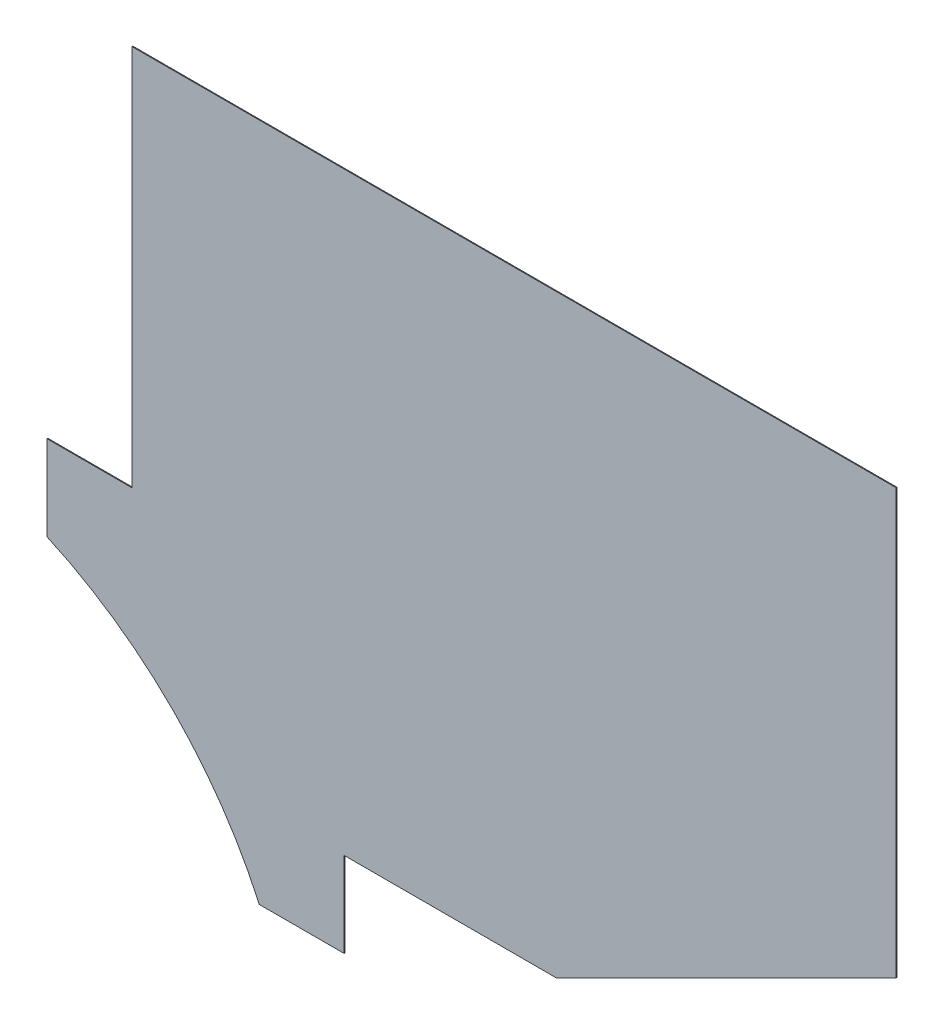
ISO-10303-21;
HEADER;
FILE_DESCRIPTION(('STEP AP214'),'2;1');
FILE_NAME('part.step','',(''),(''),'','','');
FILE_SCHEMA(('AUTOMOTIVE_DESIGN { 1 0 10303 214 1 1 1 1 }'));
ENDSEC;
DATA;
#1=APPLICATION_CONTEXT('core data for automotive mechanical design processes');
#2=APPLICATION_PROTOCOL_DEFINITION('international standard','automotive_design',2000,#1);
#3=PRODUCT_CONTEXT('',#1,'mechanical');
#4=PRODUCT('Part','Part','',(#3));
#5=PRODUCT_RELATED_PRODUCT_CATEGORY('part','',(#4));
#6=PRODUCT_DEFINITION_FORMATION('','',#4);
#7=PRODUCT_DEFINITION_CONTEXT('part definition',#1,'design');
#8=PRODUCT_DEFINITION('design','',#6,#7);
#9=PRODUCT_DEFINITION_SHAPE('','',#8);
#10=(LENGTH_UNIT() NAMED_UNIT(*) SI_UNIT(.MILLI.,.METRE.));
#11=(NAMED_UNIT(*) PLANE_ANGLE_UNIT() SI_UNIT($,.RADIAN.));
#12=(NAMED_UNIT(*) SI_UNIT($,.STERADIAN.) SOLID_ANGLE_UNIT());
#13=UNCERTAINTY_MEASURE_WITH_UNIT(LENGTH_MEASURE(1.E-05),#10,'distance_accuracy_value','');
#14=(GEOMETRIC_REPRESENTATION_CONTEXT(3) GLOBAL_UNCERTAINTY_ASSIGNED_CONTEXT((#13)) GLOBAL_UNIT_ASSIGNED_CONTEXT((#10,
#11,#12)) REPRESENTATION_CONTEXT('',''));
#15=CARTESIAN_POINT('',(0.,0.,0.));
#16=DIRECTION('',(0.,0.,1.));
#17=DIRECTION('',(1.,0.,0.));
#18=AXIS2_PLACEMENT_3D('',#15,#16,#17);
#19=CARTESIAN_POINT('',(-0.8,-1.05,0.));
#20=DIRECTION('',(0.447213595499957,-0.894427190999916,0.));
#21=DIRECTION('',(0.,0.,-1.));
#22=AXIS2_PLACEMENT_3D('',#19,#20,#21);
#23=PLANE('',#22);
#24=DIRECTION('',(-0.894427190999916,-0.447213595499957,0.));
#25=VECTOR('',#24,1.);
#26=CARTESIAN_POINT('',(-0.88,-1.09,0.001));
#27=LINE('',#26,#25);
#28=CARTESIAN_POINT('',(-0.6,-0.95,0.001));
#29=VERTEX_POINT('',#28);
#30=CARTESIAN_POINT('',(-1.,-1.15,0.001));
#31=VERTEX_POINT('',#30);
#32=EDGE_CURVE('E11',#29,#31,#27,.T.);
#33=ORIENTED_EDGE('',*,*,#32,.T.);
#34=DIRECTION('',(0.,0.,-1.));
#35=VECTOR('',#34,1.);
#36=CARTESIAN_POINT('',(-1.,-1.15,0.));
#37=LINE('',#36,#35);
#38=CARTESIAN_POINT('',(-1.,-1.15,0.));
#39=VERTEX_POINT('',#38);
#40=EDGE_CURVE('E24',#31,#39,#37,.T.);
#41=ORIENTED_EDGE('',*,*,#40,.T.);
#42=DIRECTION('',(0.894427190999916,0.447213595499957,0.));
#43=VECTOR('',#42,1.);
#44=CARTESIAN_POINT('',(-0.88,-1.09,0.));
#45=LINE('',#44,#43);
#46=CARTESIAN_POINT('',(-0.6,-0.95,0.));
#47=VERTEX_POINT('',#46);
#48=EDGE_CURVE('E178',#39,#47,#45,.T.);
#49=ORIENTED_EDGE('',*,*,#48,.T.);
#50=DIRECTION('',(0.,0.,1.));
#51=VECTOR('',#50,1.);
#52=CARTESIAN_POINT('',(-0.6,-0.95,0.));
#53=LINE('',#52,#51);
#54=EDGE_CURVE('E176',#47,#29,#53,.T.);
#55=ORIENTED_EDGE('',*,*,#54,.T.);
#56=EDGE_LOOP('',(#33,#41,#49,#55));
#57=FACE_BOUND('',#56,.T.);
#58=ADVANCED_FACE('F17',(#57),#23,.T.);
#59=CARTESIAN_POINT('',(-1.1,-0.85,0.001));
#60=DIRECTION('',(0.,0.,-1.));
#61=DIRECTION('',(1.,0.,0.));
#62=AXIS2_PLACEMENT_3D('',#59,#60,#61);
#63=PLANE('',#62);
#64=ORIENTED_EDGE('',*,*,#32,.F.);
#65=DIRECTION('',(0.,-1.,0.));
#66=VECTOR('',#65,1.);
#67=CARTESIAN_POINT('',(-0.6,-0.45,0.001));
#68=LINE('',#67,#66);
#69=CARTESIAN_POINT('',(-0.6,-0.45,0.001));
#70=VERTEX_POINT('',#69);
#71=EDGE_CURVE('E173',#70,#29,#68,.T.);
#72=ORIENTED_EDGE('',*,*,#71,.F.);
#73=DIRECTION('',(1.,0.,0.));
#74=VECTOR('',#73,1.);
#75=CARTESIAN_POINT('',(-1.5,-0.45,0.001));
#76=LINE('',#75,#74);
#77=CARTESIAN_POINT('',(-1.5,-0.45,0.001));
#78=VERTEX_POINT('',#77);
#79=EDGE_CURVE('E170',#78,#70,#76,.T.);
#80=ORIENTED_EDGE('',*,*,#79,.F.);
#81=DIRECTION('',(0.,1.,0.));
#82=VECTOR('',#81,1.);
#83=CARTESIAN_POINT('',(-1.5,-0.9,0.001));
#84=LINE('',#83,#82);
#85=CARTESIAN_POINT('',(-1.5,-0.9,0.001));
#86=VERTEX_POINT('',#85);
#87=EDGE_CURVE('E167',#86,#78,#84,.T.);
#88=ORIENTED_EDGE('',*,*,#87,.F.);
#89=DIRECTION('',(1.,0.,0.));
#90=VECTOR('',#89,1.);
#91=CARTESIAN_POINT('',(-1.6,-0.9,0.001));
#92=LINE('',#91,#90);
#93=CARTESIAN_POINT('',(-1.6,-0.9,0.001));
#94=VERTEX_POINT('',#93);
#95=EDGE_CURVE('E165',#94,#86,#92,.T.);
#96=ORIENTED_EDGE('',*,*,#95,.F.);
#97=DIRECTION('',(0.,1.,0.));
#98=VECTOR('',#97,1.);
#99=CARTESIAN_POINT('',(-1.6,-1.,0.001));
#100=LINE('',#99,#98);
#101=CARTESIAN_POINT('',(-1.6,-1.,0.001));
#102=VERTEX_POINT('',#101);
#103=EDGE_CURVE('E107',#102,#94,#100,.T.);
#104=ORIENTED_EDGE('',*,*,#103,.F.);
#105=CARTESIAN_POINT('',(-1.805718913883,-1.455718913883,0.001));
#106=DIRECTION('',(0.,0.,1.));
#107=DIRECTION('',(-0.411437827766147,-0.911437827766148,0.));
#108=AXIS2_PLACEMENT_3D('',#105,#106,#107);
#109=CIRCLE('',#108,0.5);
#110=CARTESIAN_POINT('',(-1.35,-1.25,0.001));
#111=VERTEX_POINT('',#110);
#112=EDGE_CURVE('E161',#111,#102,#109,.T.);
#113=ORIENTED_EDGE('',*,*,#112,.F.);
#114=DIRECTION('',(-1.,0.,0.));
#115=VECTOR('',#114,1.);
#116=CARTESIAN_POINT('',(1.35,-1.25,0.001));
#117=LINE('',#116,#115);
#118=CARTESIAN_POINT('',(-1.25,-1.25,0.001));
#119=VERTEX_POINT('',#118);
#120=EDGE_CURVE('E158',#119,#111,#117,.T.);
#121=ORIENTED_EDGE('',*,*,#120,.F.);
#122=DIRECTION('',(0.,-1.,0.));
#123=VECTOR('',#122,1.);
#124=CARTESIAN_POINT('',(-1.25,-1.15,0.001));
#125=LINE('',#124,#123);
#126=CARTESIAN_POINT('',(-1.25,-1.15,0.001));
#127=VERTEX_POINT('',#126);
#128=EDGE_CURVE('E155',#127,#119,#125,.T.);
#129=ORIENTED_EDGE('',*,*,#128,.F.);
#130=DIRECTION('',(-1.,0.,0.));
#131=VECTOR('',#130,1.);
#132=CARTESIAN_POINT('',(-0.6,-1.15,0.001));
#133=LINE('',#132,#131);
#134=EDGE_CURVE('E152',#31,#127,#133,.T.);
#135=ORIENTED_EDGE('',*,*,#134,.F.);
#136=EDGE_LOOP('',(#64,#72,#80,#88,#96,#104,#113,#121,#129,#135));
#137=FACE_BOUND('',#136,.T.);
#138=ADVANCED_FACE('F191',(#137),#63,.F.);
#139=CARTESIAN_POINT('',(-0.6,-0.45,0.));
#140=DIRECTION('',(-1.,0.,0.));
#141=DIRECTION('',(0.,-1.,0.));
#142=AXIS2_PLACEMENT_3D('',#139,#140,#141);
#143=PLANE('',#142);
#144=ORIENTED_EDGE('',*,*,#54,.F.);
#145=DIRECTION('',(0.,-1.,0.));
#146=VECTOR('',#145,1.);
#147=CARTESIAN_POINT('',(-0.6,-0.45,0.));
#148=LINE('',#147,#146);
#149=CARTESIAN_POINT('',(-0.6,-0.45,0.));
#150=VERTEX_POINT('',#149);
#151=EDGE_CURVE('E149',#150,#47,#148,.T.);
#152=ORIENTED_EDGE('',*,*,#151,.F.);
#153=DIRECTION('',(0.,0.,1.));
#154=VECTOR('',#153,1.);
#155=CARTESIAN_POINT('',(-0.6,-0.45,0.));
#156=LINE('',#155,#154);
#157=EDGE_CURVE('E146',#150,#70,#156,.T.);
#158=ORIENTED_EDGE('',*,*,#157,.T.);
#159=ORIENTED_EDGE('',*,*,#71,.T.);
#160=EDGE_LOOP('',(#144,#152,#158,#159));
#161=FACE_BOUND('',#160,.T.);
#162=ADVANCED_FACE('F199',(#161),#143,.F.);
#163=CARTESIAN_POINT('',(-1.805718913883,-1.455718913883,0.));
#164=DIRECTION('',(0.,0.,-1.));
#165=DIRECTION('',(-0.411437827766147,-0.911437827766148,0.));
#166=AXIS2_PLACEMENT_3D('',#163,#164,#165);
#167=CYLINDRICAL_SURFACE('',#166,0.5);
#168=CARTESIAN_POINT('',(-1.805718913883,-1.455718913883,0.));
#169=DIRECTION('',(0.,0.,1.));
#170=DIRECTION('',(-0.411437827766147,-0.911437827766148,0.));
#171=AXIS2_PLACEMENT_3D('',#168,#169,#170);
#172=CIRCLE('',#171,0.5);
#173=CARTESIAN_POINT('',(-1.35,-1.25,0.));
#174=VERTEX_POINT('',#173);
#175=CARTESIAN_POINT('',(-1.6,-1.,0.));
#176=VERTEX_POINT('',#175);
#177=EDGE_CURVE('E114',#174,#176,#172,.T.);
#178=ORIENTED_EDGE('',*,*,#177,.F.);
#179=DIRECTION('',(0.,0.,1.));
#180=VECTOR('',#179,1.);
#181=CARTESIAN_POINT('',(-1.35,-1.25,0.));
#182=LINE('',#181,#180);
#183=EDGE_CURVE('E142',#174,#111,#182,.T.);
#184=ORIENTED_EDGE('',*,*,#183,.T.);
#185=ORIENTED_EDGE('',*,*,#112,.T.);
#186=DIRECTION('',(0.,0.,1.));
#187=VECTOR('',#186,1.);
#188=CARTESIAN_POINT('',(-1.6,-1.,0.));
#189=LINE('',#188,#187);
#190=EDGE_CURVE('E140',#176,#102,#189,.T.);
#191=ORIENTED_EDGE('',*,*,#190,.F.);
#192=EDGE_LOOP('',(#178,#184,#185,#191));
#193=FACE_BOUND('',#192,.T.);
#194=ADVANCED_FACE('F190',(#193),#167,.F.);
#195=CARTESIAN_POINT('',(-1.25,-1.25,0.));
#196=DIRECTION('',(0.,1.,0.));
#197=DIRECTION('',(-1.,0.,0.));
#198=AXIS2_PLACEMENT_3D('',#195,#196,#197);
#199=PLANE('',#198);
#200=DIRECTION('',(-1.,0.,0.));
#201=VECTOR('',#200,1.);
#202=CARTESIAN_POINT('',(1.35,-1.25,0.));
#203=LINE('',#202,#201);
#204=CARTESIAN_POINT('',(-1.25,-1.25,0.));
#205=VERTEX_POINT('',#204);
#206=EDGE_CURVE('E138',#205,#174,#203,.T.);
#207=ORIENTED_EDGE('',*,*,#206,.F.);
#208=DIRECTION('',(0.,0.,1.));
#209=VECTOR('',#208,1.);
#210=CARTESIAN_POINT('',(-1.25,-1.25,0.));
#211=LINE('',#210,#209);
#212=EDGE_CURVE('E135',#205,#119,#211,.T.);
#213=ORIENTED_EDGE('',*,*,#212,.T.);
#214=ORIENTED_EDGE('',*,*,#120,.T.);
#215=ORIENTED_EDGE('',*,*,#183,.F.);
#216=EDGE_LOOP('',(#207,#213,#214,#215));
#217=FACE_BOUND('',#216,.T.);
#218=ADVANCED_FACE('F188',(#217),#199,.F.);
#219=CARTESIAN_POINT('',(-1.25,-1.15,0.));
#220=DIRECTION('',(-1.,0.,0.));
#221=DIRECTION('',(0.,-1.,0.));
#222=AXIS2_PLACEMENT_3D('',#219,#220,#221);
#223=PLANE('',#222);
#224=DIRECTION('',(0.,-1.,0.));
#225=VECTOR('',#224,1.);
#226=CARTESIAN_POINT('',(-1.25,-1.15,0.));
#227=LINE('',#226,#225);
#228=CARTESIAN_POINT('',(-1.25,-1.15,0.));
#229=VERTEX_POINT('',#228);
#230=EDGE_CURVE('E132',#229,#205,#227,.T.);
#231=ORIENTED_EDGE('',*,*,#230,.F.);
#232=DIRECTION('',(0.,0.,1.));
#233=VECTOR('',#232,1.);
#234=CARTESIAN_POINT('',(-1.25,-1.15,0.));
#235=LINE('',#234,#233);
#236=EDGE_CURVE('E129',#229,#127,#235,.T.);
#237=ORIENTED_EDGE('',*,*,#236,.T.);
#238=ORIENTED_EDGE('',*,*,#128,.T.);
#239=ORIENTED_EDGE('',*,*,#212,.F.);
#240=EDGE_LOOP('',(#231,#237,#238,#239));
#241=FACE_BOUND('',#240,.T.);
#242=ADVANCED_FACE('F185',(#241),#223,.F.);
#243=CARTESIAN_POINT('',(-0.6,-1.15,0.));
#244=DIRECTION('',(0.,1.,0.));
#245=DIRECTION('',(-1.,0.,0.));
#246=AXIS2_PLACEMENT_3D('',#243,#244,#245);
#247=PLANE('',#246);
#248=ORIENTED_EDGE('',*,*,#40,.F.);
#249=ORIENTED_EDGE('',*,*,#134,.T.);
#250=ORIENTED_EDGE('',*,*,#236,.F.);
#251=DIRECTION('',(-1.,0.,0.));
#252=VECTOR('',#251,1.);
#253=CARTESIAN_POINT('',(-0.6,-1.15,0.));
#254=LINE('',#253,#252);
#255=EDGE_CURVE('E126',#39,#229,#254,.T.);
#256=ORIENTED_EDGE('',*,*,#255,.F.);
#257=EDGE_LOOP('',(#248,#249,#250,#256));
#258=FACE_BOUND('',#257,.T.);
#259=ADVANCED_FACE('F183',(#258),#247,.F.);
#260=CARTESIAN_POINT('',(-1.5,-0.45,0.));
#261=DIRECTION('',(0.,-1.,0.));
#262=DIRECTION('',(1.,0.,0.));
#263=AXIS2_PLACEMENT_3D('',#260,#261,#262);
#264=PLANE('',#263);
#265=DIRECTION('',(1.,0.,0.));
#266=VECTOR('',#265,1.);
#267=CARTESIAN_POINT('',(-1.5,-0.45,0.));
#268=LINE('',#267,#266);
#269=CARTESIAN_POINT('',(-1.5,-0.45,0.));
#270=VERTEX_POINT('',#269);
#271=EDGE_CURVE('E123',#270,#150,#268,.T.);
#272=ORIENTED_EDGE('',*,*,#271,.F.);
#273=DIRECTION('',(0.,0.,1.));
#274=VECTOR('',#273,1.);
#275=CARTESIAN_POINT('',(-1.5,-0.45,0.));
#276=LINE('',#275,#274);
#277=EDGE_CURVE('E120',#270,#78,#276,.T.);
#278=ORIENTED_EDGE('',*,*,#277,.T.);
#279=ORIENTED_EDGE('',*,*,#79,.T.);
#280=ORIENTED_EDGE('',*,*,#157,.F.);
#281=EDGE_LOOP('',(#272,#278,#279,#280));
#282=FACE_BOUND('',#281,.T.);
#283=ADVANCED_FACE('F197',(#282),#264,.F.);
#284=CARTESIAN_POINT('',(-1.5,-0.9,0.));
#285=DIRECTION('',(1.,0.,0.));
#286=DIRECTION('',(0.,1.,0.));
#287=AXIS2_PLACEMENT_3D('',#284,#285,#286);
#288=PLANE('',#287);
#289=DIRECTION('',(0.,1.,0.));
#290=VECTOR('',#289,1.);
#291=CARTESIAN_POINT('',(-1.5,-0.9,0.));
#292=LINE('',#291,#290);
#293=CARTESIAN_POINT('',(-1.5,-0.9,0.));
#294=VERTEX_POINT('',#293);
#295=EDGE_CURVE('E118',#294,#270,#292,.T.);
#296=ORIENTED_EDGE('',*,*,#295,.F.);
#297=DIRECTION('',(0.,0.,1.));
#298=VECTOR('',#297,1.);
#299=CARTESIAN_POINT('',(-1.5,-0.9,0.));
#300=LINE('',#299,#298);
#301=EDGE_CURVE('E96',#294,#86,#300,.T.);
#302=ORIENTED_EDGE('',*,*,#301,.T.);
#303=ORIENTED_EDGE('',*,*,#87,.T.);
#304=ORIENTED_EDGE('',*,*,#277,.F.);
#305=EDGE_LOOP('',(#296,#302,#303,#304));
#306=FACE_BOUND('',#305,.T.);
#307=ADVANCED_FACE('F193',(#306),#288,.F.);
#308=CARTESIAN_POINT('',(-1.6,-0.9,0.));
#309=DIRECTION('',(0.,-1.,0.));
#310=DIRECTION('',(1.,0.,0.));
#311=AXIS2_PLACEMENT_3D('',#308,#309,#310);
#312=PLANE('',#311);
#313=DIRECTION('',(1.,0.,0.));
#314=VECTOR('',#313,1.);
#315=CARTESIAN_POINT('',(-1.6,-0.9,0.));
#316=LINE('',#315,#314);
#317=CARTESIAN_POINT('',(-1.6,-0.9,0.));
#318=VERTEX_POINT('',#317);
#319=EDGE_CURVE('E90',#318,#294,#316,.T.);
#320=ORIENTED_EDGE('',*,*,#319,.F.);
#321=DIRECTION('',(0.,0.,1.));
#322=VECTOR('',#321,1.);
#323=CARTESIAN_POINT('',(-1.6,-0.9,0.));
#324=LINE('',#323,#322);
#325=EDGE_CURVE('E94',#318,#94,#324,.T.);
#326=ORIENTED_EDGE('',*,*,#325,.T.);
#327=ORIENTED_EDGE('',*,*,#95,.T.);
#328=ORIENTED_EDGE('',*,*,#301,.F.);
#329=EDGE_LOOP('',(#320,#326,#327,#328));
#330=FACE_BOUND('',#329,.T.);
#331=ADVANCED_FACE('F92',(#330),#312,.F.);
#332=CARTESIAN_POINT('',(-1.6,-1.,0.));
#333=DIRECTION('',(1.,0.,0.));
#334=DIRECTION('',(0.,1.,0.));
#335=AXIS2_PLACEMENT_3D('',#332,#333,#334);
#336=PLANE('',#335);
#337=DIRECTION('',(0.,1.,0.));
#338=VECTOR('',#337,1.);
#339=CARTESIAN_POINT('',(-1.6,-1.,0.));
#340=LINE('',#339,#338);
#341=EDGE_CURVE('E106',#176,#318,#340,.T.);
#342=ORIENTED_EDGE('',*,*,#341,.F.);
#343=ORIENTED_EDGE('',*,*,#190,.T.);
#344=ORIENTED_EDGE('',*,*,#103,.T.);
#345=ORIENTED_EDGE('',*,*,#325,.F.);
#346=EDGE_LOOP('',(#342,#343,#344,#345));
#347=FACE_BOUND('',#346,.T.);
#348=ADVANCED_FACE('F104',(#347),#336,.F.);
#349=CARTESIAN_POINT('',(-1.1,-0.85,0.));
#350=DIRECTION('',(0.,0.,-1.));
#351=DIRECTION('',(1.,0.,0.));
#352=AXIS2_PLACEMENT_3D('',#349,#350,#351);
#353=PLANE('',#352);
#354=ORIENTED_EDGE('',*,*,#48,.F.);
#355=ORIENTED_EDGE('',*,*,#255,.T.);
#356=ORIENTED_EDGE('',*,*,#230,.T.);
#357=ORIENTED_EDGE('',*,*,#206,.T.);
#358=ORIENTED_EDGE('',*,*,#177,.T.);
#359=ORIENTED_EDGE('',*,*,#341,.T.);
#360=ORIENTED_EDGE('',*,*,#319,.T.);
#361=ORIENTED_EDGE('',*,*,#295,.T.);
#362=ORIENTED_EDGE('',*,*,#271,.T.);
#363=ORIENTED_EDGE('',*,*,#151,.T.);
#364=EDGE_LOOP('',(#354,#355,#356,#357,#358,#359,#360,#361,#362,#363));
#365=FACE_BOUND('',#364,.T.);
#366=ADVANCED_FACE('F111',(#365),#353,.T.);
#367=CLOSED_SHELL('',(#58,#138,#162,#194,#218,#242,#259,#283,#307,#331,#348,#366));
#368=MANIFOLD_SOLID_BREP('B1',#367);
#369=ADVANCED_BREP_SHAPE_REPRESENTATION('',(#18,#368),#14);
#370=SHAPE_DEFINITION_REPRESENTATION(#9,#369);
ENDSEC;
END-ISO-10303-21;
